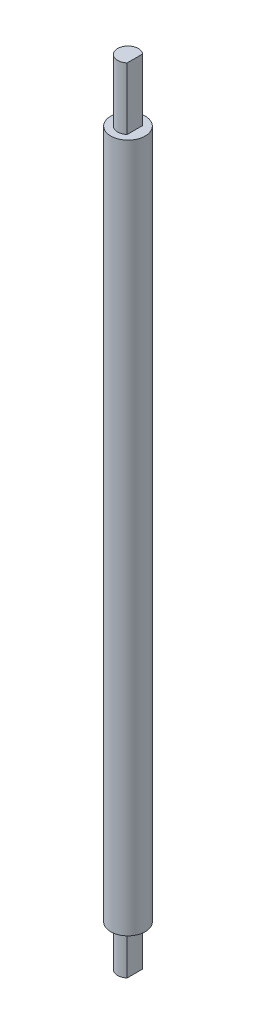
ISO-10303-21;
HEADER;
FILE_DESCRIPTION(('STEP AP214'),'2;1');
FILE_NAME('part.step','',(''),(''),'','','');
FILE_SCHEMA(('AUTOMOTIVE_DESIGN { 1 0 10303 214 1 1 1 1 }'));
ENDSEC;
DATA;
#1=APPLICATION_CONTEXT('core data for automotive mechanical design processes');
#2=APPLICATION_PROTOCOL_DEFINITION('international standard','automotive_design',2000,#1);
#3=PRODUCT_CONTEXT('',#1,'mechanical');
#4=PRODUCT('Part','Part','',(#3));
#5=PRODUCT_RELATED_PRODUCT_CATEGORY('part','',(#4));
#6=PRODUCT_DEFINITION_FORMATION('','',#4);
#7=PRODUCT_DEFINITION_CONTEXT('part definition',#1,'design');
#8=PRODUCT_DEFINITION('design','',#6,#7);
#9=PRODUCT_DEFINITION_SHAPE('','',#8);
#10=(LENGTH_UNIT() NAMED_UNIT(*) SI_UNIT(.MILLI.,.METRE.));
#11=(NAMED_UNIT(*) PLANE_ANGLE_UNIT() SI_UNIT($,.RADIAN.));
#12=(NAMED_UNIT(*) SI_UNIT($,.STERADIAN.) SOLID_ANGLE_UNIT());
#13=UNCERTAINTY_MEASURE_WITH_UNIT(LENGTH_MEASURE(1.E-05),#10,'distance_accuracy_value','');
#14=(GEOMETRIC_REPRESENTATION_CONTEXT(3) GLOBAL_UNCERTAINTY_ASSIGNED_CONTEXT((#13)) GLOBAL_UNIT_ASSIGNED_CONTEXT((#10,
#11,#12)) REPRESENTATION_CONTEXT('',''));
#15=CARTESIAN_POINT('',(0.,0.,0.));
#16=DIRECTION('',(0.,0.,1.));
#17=DIRECTION('',(1.,0.,0.));
#18=AXIS2_PLACEMENT_3D('',#15,#16,#17);
#19=CARTESIAN_POINT('',(0.,0.,0.));
#20=DIRECTION('',(0.,1.,0.));
#21=DIRECTION('',(0.,0.,1.));
#22=AXIS2_PLACEMENT_3D('',#19,#20,#21);
#23=PLANE('',#22);
#24=CARTESIAN_POINT('',(0.,0.,0.));
#25=DIRECTION('',(0.,1.,0.));
#26=DIRECTION('',(0.,0.,1.));
#27=AXIS2_PLACEMENT_3D('',#24,#25,#26);
#28=CIRCLE('',#27,2.5);
#29=CARTESIAN_POINT('',(0.,0.,2.5));
#30=VERTEX_POINT('',#29);
#31=EDGE_CURVE('E40',#30,#30,#28,.T.);
#32=ORIENTED_EDGE('',*,*,#31,.F.);
#33=EDGE_LOOP('',(#32));
#34=FACE_BOUND('',#33,.T.);
#35=CARTESIAN_POINT('',(0.,0.,0.));
#36=DIRECTION('',(0.,-1.,0.));
#37=DIRECTION('',(0.,0.,1.));
#38=AXIS2_PLACEMENT_3D('',#35,#36,#37);
#39=CIRCLE('',#38,1.5);
#40=CARTESIAN_POINT('',(1.,0.,1.11803398874989));
#41=VERTEX_POINT('',#40);
#42=CARTESIAN_POINT('',(1.,0.,-1.11803398874989));
#43=VERTEX_POINT('',#42);
#44=EDGE_CURVE('E92',#41,#43,#39,.T.);
#45=ORIENTED_EDGE('',*,*,#44,.F.);
#46=DIRECTION('',(0.,0.,1.));
#47=VECTOR('',#46,1.);
#48=CARTESIAN_POINT('',(1.,0.,-1.11803398874989));
#49=LINE('',#48,#47);
#50=EDGE_CURVE('E50',#43,#41,#49,.T.);
#51=ORIENTED_EDGE('',*,*,#50,.F.);
#52=EDGE_LOOP('',(#45,#51));
#53=FACE_BOUND('',#52,.T.);
#54=ADVANCED_FACE('F36',(#34,#53),#23,.F.);
#55=CARTESIAN_POINT('',(0.,100.,0.));
#56=DIRECTION('',(0.,-1.,0.));
#57=DIRECTION('',(0.,0.,-1.));
#58=AXIS2_PLACEMENT_3D('',#55,#56,#57);
#59=CYLINDRICAL_SURFACE('',#58,2.5);
#60=CARTESIAN_POINT('',(0.,100.,0.));
#61=DIRECTION('',(0.,1.,0.));
#62=DIRECTION('',(0.,0.,1.));
#63=AXIS2_PLACEMENT_3D('',#60,#61,#62);
#64=CIRCLE('',#63,2.5);
#65=CARTESIAN_POINT('',(0.,100.,2.5));
#66=VERTEX_POINT('',#65);
#67=EDGE_CURVE('E11',#66,#66,#64,.T.);
#68=ORIENTED_EDGE('',*,*,#67,.F.);
#69=EDGE_LOOP('',(#68));
#70=FACE_BOUND('',#69,.T.);
#71=ORIENTED_EDGE('',*,*,#31,.T.);
#72=EDGE_LOOP('',(#71));
#73=FACE_BOUND('',#72,.T.);
#74=ADVANCED_FACE('F38',(#70,#73),#59,.T.);
#75=CARTESIAN_POINT('',(0.,100.,0.));
#76=DIRECTION('',(0.,1.,0.));
#77=DIRECTION('',(0.,0.,1.));
#78=AXIS2_PLACEMENT_3D('',#75,#76,#77);
#79=PLANE('',#78);
#80=CARTESIAN_POINT('',(0.,100.,0.));
#81=DIRECTION('',(0.,1.,0.));
#82=DIRECTION('',(0.,0.,-1.));
#83=AXIS2_PLACEMENT_3D('',#80,#81,#82);
#84=CIRCLE('',#83,1.5);
#85=CARTESIAN_POINT('',(1.,100.,-1.11803398874989));
#86=VERTEX_POINT('',#85);
#87=CARTESIAN_POINT('',(1.,100.,1.11803398874989));
#88=VERTEX_POINT('',#87);
#89=EDGE_CURVE('E93',#86,#88,#84,.T.);
#90=ORIENTED_EDGE('',*,*,#89,.F.);
#91=DIRECTION('',(0.,0.,-1.));
#92=VECTOR('',#91,1.);
#93=CARTESIAN_POINT('',(1.,100.,-1.11803398874989));
#94=LINE('',#93,#92);
#95=EDGE_CURVE('E57',#88,#86,#94,.T.);
#96=ORIENTED_EDGE('',*,*,#95,.F.);
#97=EDGE_LOOP('',(#90,#96));
#98=FACE_BOUND('',#97,.T.);
#99=ORIENTED_EDGE('',*,*,#67,.T.);
#100=EDGE_LOOP('',(#99));
#101=FACE_BOUND('',#100,.T.);
#102=ADVANCED_FACE('F121',(#98,#101),#79,.T.);
#103=CARTESIAN_POINT('',(0.,109.,0.));
#104=DIRECTION('',(0.,-1.,0.));
#105=DIRECTION('',(0.,0.,-1.));
#106=AXIS2_PLACEMENT_3D('',#103,#104,#105);
#107=CYLINDRICAL_SURFACE('',#106,1.5);
#108=ORIENTED_EDGE('',*,*,#89,.T.);
#109=DIRECTION('',(0.,-1.,0.));
#110=VECTOR('',#109,1.);
#111=CARTESIAN_POINT('',(1.,109.,1.11803398874989));
#112=LINE('',#111,#110);
#113=CARTESIAN_POINT('',(1.,109.,1.11803398874989));
#114=VERTEX_POINT('',#113);
#115=EDGE_CURVE('E109',#114,#88,#112,.T.);
#116=ORIENTED_EDGE('',*,*,#115,.F.);
#117=CARTESIAN_POINT('',(0.,109.,0.));
#118=DIRECTION('',(0.,1.,0.));
#119=DIRECTION('',(0.,0.,-1.));
#120=AXIS2_PLACEMENT_3D('',#117,#118,#119);
#121=CIRCLE('',#120,1.5);
#122=CARTESIAN_POINT('',(1.,109.,-1.11803398874989));
#123=VERTEX_POINT('',#122);
#124=EDGE_CURVE('E100',#123,#114,#121,.T.);
#125=ORIENTED_EDGE('',*,*,#124,.F.);
#126=DIRECTION('',(0.,-1.,0.));
#127=VECTOR('',#126,1.);
#128=CARTESIAN_POINT('',(1.,109.,-1.11803398874989));
#129=LINE('',#128,#127);
#130=EDGE_CURVE('E104',#123,#86,#129,.T.);
#131=ORIENTED_EDGE('',*,*,#130,.T.);
#132=EDGE_LOOP('',(#108,#116,#125,#131));
#133=FACE_BOUND('',#132,.T.);
#134=ADVANCED_FACE('F126',(#133),#107,.T.);
#135=CARTESIAN_POINT('',(1.,109.,-1.11803398874989));
#136=DIRECTION('',(-1.,0.,0.));
#137=DIRECTION('',(0.,0.,1.));
#138=AXIS2_PLACEMENT_3D('',#135,#136,#137);
#139=PLANE('',#138);
#140=ORIENTED_EDGE('',*,*,#95,.T.);
#141=ORIENTED_EDGE('',*,*,#130,.F.);
#142=DIRECTION('',(0.,0.,-1.));
#143=VECTOR('',#142,1.);
#144=CARTESIAN_POINT('',(1.,109.,-1.11803398874989));
#145=LINE('',#144,#143);
#146=EDGE_CURVE('E103',#114,#123,#145,.T.);
#147=ORIENTED_EDGE('',*,*,#146,.F.);
#148=ORIENTED_EDGE('',*,*,#115,.T.);
#149=EDGE_LOOP('',(#140,#141,#147,#148));
#150=FACE_BOUND('',#149,.T.);
#151=ADVANCED_FACE('F129',(#150),#139,.F.);
#152=CARTESIAN_POINT('',(0.,109.,0.));
#153=DIRECTION('',(0.,-1.,0.));
#154=DIRECTION('',(0.,0.,-1.));
#155=AXIS2_PLACEMENT_3D('',#152,#153,#154);
#156=PLANE('',#155);
#157=ORIENTED_EDGE('',*,*,#124,.T.);
#158=ORIENTED_EDGE('',*,*,#146,.T.);
#159=EDGE_LOOP('',(#157,#158));
#160=FACE_BOUND('',#159,.T.);
#161=ADVANCED_FACE('F133',(#160),#156,.F.);
#162=CARTESIAN_POINT('',(0.,-6.,0.));
#163=DIRECTION('',(0.,1.,0.));
#164=DIRECTION('',(0.,0.,1.));
#165=AXIS2_PLACEMENT_3D('',#162,#163,#164);
#166=CYLINDRICAL_SURFACE('',#165,1.5);
#167=ORIENTED_EDGE('',*,*,#44,.T.);
#168=DIRECTION('',(0.,1.,0.));
#169=VECTOR('',#168,1.);
#170=CARTESIAN_POINT('',(1.,-6.,-1.11803398874989));
#171=LINE('',#170,#169);
#172=CARTESIAN_POINT('',(1.,-6.,-1.11803398874989));
#173=VERTEX_POINT('',#172);
#174=EDGE_CURVE('E80',#173,#43,#171,.T.);
#175=ORIENTED_EDGE('',*,*,#174,.F.);
#176=CARTESIAN_POINT('',(0.,-6.,0.));
#177=DIRECTION('',(0.,-1.,0.));
#178=DIRECTION('',(0.,0.,1.));
#179=AXIS2_PLACEMENT_3D('',#176,#177,#178);
#180=CIRCLE('',#179,1.5);
#181=CARTESIAN_POINT('',(1.,-6.,1.11803398874989));
#182=VERTEX_POINT('',#181);
#183=EDGE_CURVE('E86',#182,#173,#180,.T.);
#184=ORIENTED_EDGE('',*,*,#183,.F.);
#185=DIRECTION('',(0.,1.,0.));
#186=VECTOR('',#185,1.);
#187=CARTESIAN_POINT('',(1.,-6.,1.11803398874989));
#188=LINE('',#187,#186);
#189=EDGE_CURVE('E83',#182,#41,#188,.T.);
#190=ORIENTED_EDGE('',*,*,#189,.T.);
#191=EDGE_LOOP('',(#167,#175,#184,#190));
#192=FACE_BOUND('',#191,.T.);
#193=ADVANCED_FACE('F91',(#192),#166,.T.);
#194=CARTESIAN_POINT('',(1.,-6.,-1.11803398874989));
#195=DIRECTION('',(-1.,0.,0.));
#196=DIRECTION('',(0.,0.,1.));
#197=AXIS2_PLACEMENT_3D('',#194,#195,#196);
#198=PLANE('',#197);
#199=ORIENTED_EDGE('',*,*,#50,.T.);
#200=ORIENTED_EDGE('',*,*,#189,.F.);
#201=DIRECTION('',(0.,0.,1.));
#202=VECTOR('',#201,1.);
#203=CARTESIAN_POINT('',(1.,-6.,-1.11803398874989));
#204=LINE('',#203,#202);
#205=EDGE_CURVE('E76',#173,#182,#204,.T.);
#206=ORIENTED_EDGE('',*,*,#205,.F.);
#207=ORIENTED_EDGE('',*,*,#174,.T.);
#208=EDGE_LOOP('',(#199,#200,#206,#207));
#209=FACE_BOUND('',#208,.T.);
#210=ADVANCED_FACE('F78',(#209),#198,.F.);
#211=CARTESIAN_POINT('',(0.,-6.,0.));
#212=DIRECTION('',(0.,1.,0.));
#213=DIRECTION('',(0.,0.,1.));
#214=AXIS2_PLACEMENT_3D('',#211,#212,#213);
#215=PLANE('',#214);
#216=ORIENTED_EDGE('',*,*,#183,.T.);
#217=ORIENTED_EDGE('',*,*,#205,.T.);
#218=EDGE_LOOP('',(#216,#217));
#219=FACE_BOUND('',#218,.T.);
#220=ADVANCED_FACE('F88',(#219),#215,.F.);
#221=CLOSED_SHELL('',(#54,#74,#102,#134,#151,#161,#193,#210,#220));
#222=MANIFOLD_SOLID_BREP('B2',#221);
#223=ADVANCED_BREP_SHAPE_REPRESENTATION('',(#18,#222),#14);
#224=SHAPE_DEFINITION_REPRESENTATION(#9,#223);
ENDSEC;
END-ISO-10303-21;
